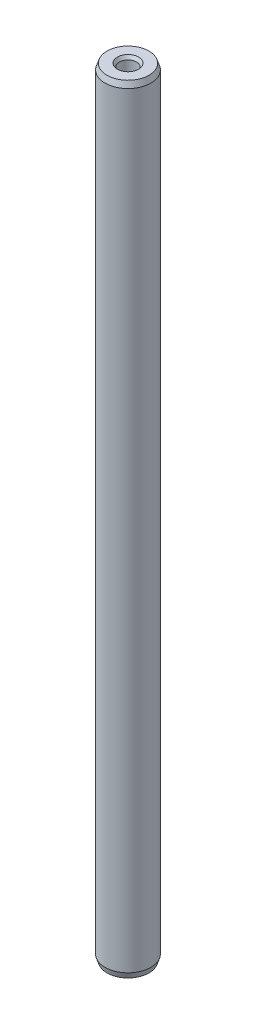
ISO-10303-21;
HEADER;
FILE_DESCRIPTION(('STEP AP214'),'2;1');
FILE_NAME('part.step','',(''),(''),'','','');
FILE_SCHEMA(('AUTOMOTIVE_DESIGN { 1 0 10303 214 1 1 1 1 }'));
ENDSEC;
DATA;
#1=APPLICATION_CONTEXT('core data for automotive mechanical design processes');
#2=APPLICATION_PROTOCOL_DEFINITION('international standard','automotive_design',2000,#1);
#3=PRODUCT_CONTEXT('',#1,'mechanical');
#4=PRODUCT('Part','Part','',(#3));
#5=PRODUCT_RELATED_PRODUCT_CATEGORY('part','',(#4));
#6=PRODUCT_DEFINITION_FORMATION('','',#4);
#7=PRODUCT_DEFINITION_CONTEXT('part definition',#1,'design');
#8=PRODUCT_DEFINITION('design','',#6,#7);
#9=PRODUCT_DEFINITION_SHAPE('','',#8);
#10=(LENGTH_UNIT() NAMED_UNIT(*) SI_UNIT(.MILLI.,.METRE.));
#11=(NAMED_UNIT(*) PLANE_ANGLE_UNIT() SI_UNIT($,.RADIAN.));
#12=(NAMED_UNIT(*) SI_UNIT($,.STERADIAN.) SOLID_ANGLE_UNIT());
#13=UNCERTAINTY_MEASURE_WITH_UNIT(LENGTH_MEASURE(1.E-05),#10,'distance_accuracy_value','');
#14=(GEOMETRIC_REPRESENTATION_CONTEXT(3) GLOBAL_UNCERTAINTY_ASSIGNED_CONTEXT((#13)) GLOBAL_UNIT_ASSIGNED_CONTEXT((#10,
#11,#12)) REPRESENTATION_CONTEXT('',''));
#15=CARTESIAN_POINT('',(0.,0.,0.));
#16=DIRECTION('',(0.,0.,1.));
#17=DIRECTION('',(1.,0.,0.));
#18=AXIS2_PLACEMENT_3D('',#15,#16,#17);
#19=CARTESIAN_POINT('',(-1.06592274227068,53.2859369307251,-1.12643595849704));
#20=DIRECTION('',(0.,-1.,0.));
#21=DIRECTION('',(0.,0.,-1.));
#22=AXIS2_PLACEMENT_3D('',#19,#20,#21);
#23=PLANE('',#22);
#24=CARTESIAN_POINT('',(-1.06592274227068,53.2859369307251,-1.12643595849704));
#25=DIRECTION('',(0.,-1.,0.));
#26=DIRECTION('',(0.,0.,-1.));
#27=AXIS2_PLACEMENT_3D('',#24,#25,#26);
#28=CIRCLE('',#27,1.38429999999998);
#29=CARTESIAN_POINT('',(-1.06592274227068,53.2859369307251,-2.51073595849702));
#30=VERTEX_POINT('',#29);
#31=EDGE_CURVE('E11',#30,#30,#28,.T.);
#32=ORIENTED_EDGE('',*,*,#31,.T.);
#33=EDGE_LOOP('',(#32));
#34=FACE_BOUND('',#33,.T.);
#35=CARTESIAN_POINT('',(-1.06592274227068,53.2859369307251,-1.12643595849704));
#36=DIRECTION('',(0.,1.,0.));
#37=DIRECTION('',(0.,0.,1.));
#38=AXIS2_PLACEMENT_3D('',#35,#36,#37);
#39=CIRCLE('',#38,2.74319999999999);
#40=CARTESIAN_POINT('',(-1.06592274227068,53.2859369307251,1.61676404150295));
#41=VERTEX_POINT('',#40);
#42=EDGE_CURVE('E57',#41,#41,#39,.T.);
#43=ORIENTED_EDGE('',*,*,#42,.T.);
#44=EDGE_LOOP('',(#43));
#45=FACE_BOUND('',#44,.T.);
#46=ADVANCED_FACE('F19',(#34,#45),#23,.F.);
#47=CARTESIAN_POINT('',(-1.06592274227068,52.5239369307251,-1.12643595849704));
#48=DIRECTION('',(0.,-1.,0.));
#49=DIRECTION('',(0.,0.,-1.));
#50=AXIS2_PLACEMENT_3D('',#47,#48,#49);
#51=CONICAL_SURFACE('',#50,2.9972,0.321750554396658);
#52=ORIENTED_EDGE('',*,*,#42,.F.);
#53=EDGE_LOOP('',(#52));
#54=FACE_BOUND('',#53,.T.);
#55=CARTESIAN_POINT('',(-1.06592274227068,52.5239369307251,-1.12643595849704));
#56=DIRECTION('',(0.,1.,0.));
#57=DIRECTION('',(0.,0.,1.));
#58=AXIS2_PLACEMENT_3D('',#55,#56,#57);
#59=CIRCLE('',#58,2.9972);
#60=CARTESIAN_POINT('',(-1.06592274227068,52.5239369307251,1.87076404150296));
#61=VERTEX_POINT('',#60);
#62=EDGE_CURVE('E54',#61,#61,#59,.T.);
#63=ORIENTED_EDGE('',*,*,#62,.T.);
#64=EDGE_LOOP('',(#63));
#65=FACE_BOUND('',#64,.T.);
#66=ADVANCED_FACE('F79',(#54,#65),#51,.T.);
#67=CARTESIAN_POINT('',(-1.06592274227068,53.2859369307251,-1.12643595849704));
#68=DIRECTION('',(0.,1.,0.));
#69=DIRECTION('',(0.,0.,1.));
#70=AXIS2_PLACEMENT_3D('',#67,#68,#69);
#71=CYLINDRICAL_SURFACE('',#70,2.9972);
#72=ORIENTED_EDGE('',*,*,#62,.F.);
#73=EDGE_LOOP('',(#72));
#74=FACE_BOUND('',#73,.T.);
#75=CARTESIAN_POINT('',(-1.06592274227068,-47.5520630692749,-1.12643595849704));
#76=DIRECTION('',(0.,1.,0.));
#77=DIRECTION('',(0.,0.,1.));
#78=AXIS2_PLACEMENT_3D('',#75,#76,#77);
#79=CIRCLE('',#78,2.9972);
#80=CARTESIAN_POINT('',(-1.06592274227068,-47.5520630692749,1.87076404150296));
#81=VERTEX_POINT('',#80);
#82=EDGE_CURVE('E51',#81,#81,#79,.T.);
#83=ORIENTED_EDGE('',*,*,#82,.T.);
#84=EDGE_LOOP('',(#83));
#85=FACE_BOUND('',#84,.T.);
#86=ADVANCED_FACE('F87',(#74,#85),#71,.T.);
#87=CARTESIAN_POINT('',(-1.06592274227068,-48.3140630692749,-1.12643595849704));
#88=DIRECTION('',(0.,1.,0.));
#89=DIRECTION('',(0.,0.,1.));
#90=AXIS2_PLACEMENT_3D('',#87,#88,#89);
#91=CONICAL_SURFACE('',#90,2.74319999999999,0.321750554396658);
#92=ORIENTED_EDGE('',*,*,#82,.F.);
#93=EDGE_LOOP('',(#92));
#94=FACE_BOUND('',#93,.T.);
#95=CARTESIAN_POINT('',(-1.06592274227068,-48.3140630692749,-1.12643595849704));
#96=DIRECTION('',(0.,1.,0.));
#97=DIRECTION('',(0.,0.,1.));
#98=AXIS2_PLACEMENT_3D('',#95,#96,#97);
#99=CIRCLE('',#98,2.74319999999999);
#100=CARTESIAN_POINT('',(-1.06592274227068,-48.3140630692749,1.61676404150295));
#101=VERTEX_POINT('',#100);
#102=EDGE_CURVE('E46',#101,#101,#99,.T.);
#103=ORIENTED_EDGE('',*,*,#102,.T.);
#104=EDGE_LOOP('',(#103));
#105=FACE_BOUND('',#104,.T.);
#106=ADVANCED_FACE('F94',(#94,#105),#91,.T.);
#107=CARTESIAN_POINT('',(1.67727725772931,-48.3140630692749,-1.12643595849704));
#108=DIRECTION('',(0.,1.,0.));
#109=DIRECTION('',(0.,0.,1.));
#110=AXIS2_PLACEMENT_3D('',#107,#108,#109);
#111=PLANE('',#110);
#112=CARTESIAN_POINT('',(-1.06592274227068,-48.3140630692749,-1.12643595849704));
#113=DIRECTION('',(0.,1.,0.));
#114=DIRECTION('',(0.,0.,1.));
#115=AXIS2_PLACEMENT_3D('',#112,#113,#114);
#116=CIRCLE('',#115,1.38429999999998);
#117=CARTESIAN_POINT('',(-1.06592274227068,-48.3140630692749,0.257864041502937));
#118=VERTEX_POINT('',#117);
#119=EDGE_CURVE('E63',#118,#118,#116,.T.);
#120=ORIENTED_EDGE('',*,*,#119,.T.);
#121=EDGE_LOOP('',(#120));
#122=FACE_BOUND('',#121,.T.);
#123=ORIENTED_EDGE('',*,*,#102,.F.);
#124=EDGE_LOOP('',(#123));
#125=FACE_BOUND('',#124,.T.);
#126=ADVANCED_FACE('F98',(#122,#125),#111,.F.);
#127=CARTESIAN_POINT('',(-1.06592274227068,-48.3140630692749,-1.12643595849704));
#128=DIRECTION('',(0.,-1.,0.));
#129=DIRECTION('',(0.,0.,-1.));
#130=AXIS2_PLACEMENT_3D('',#127,#128,#129);
#131=CYLINDRICAL_SURFACE('',#130,1.1303);
#132=CARTESIAN_POINT('',(-1.06592274227068,-47.8741221641525,-1.12643595849704));
#133=DIRECTION('',(0.,1.,0.));
#134=DIRECTION('',(0.,0.,1.));
#135=AXIS2_PLACEMENT_3D('',#132,#133,#134);
#136=CIRCLE('',#135,1.1303);
#137=CARTESIAN_POINT('',(-1.06592274227068,-47.8741221641525,0.00386404150295831));
#138=VERTEX_POINT('',#137);
#139=EDGE_CURVE('E60',#138,#138,#136,.F.);
#140=ORIENTED_EDGE('',*,*,#139,.T.);
#141=EDGE_LOOP('',(#140));
#142=FACE_BOUND('',#141,.T.);
#143=CARTESIAN_POINT('',(-1.06592274227068,-42.5990630692749,-1.12643595849704));
#144=DIRECTION('',(0.,-1.,0.));
#145=DIRECTION('',(0.,0.,-1.));
#146=AXIS2_PLACEMENT_3D('',#143,#144,#145);
#147=CIRCLE('',#146,1.1303);
#148=CARTESIAN_POINT('',(-1.06592274227068,-42.5990630692749,-2.25673595849704));
#149=VERTEX_POINT('',#148);
#150=EDGE_CURVE('E43',#149,#149,#147,.T.);
#151=ORIENTED_EDGE('',*,*,#150,.F.);
#152=EDGE_LOOP('',(#151));
#153=FACE_BOUND('',#152,.T.);
#154=ADVANCED_FACE('F102',(#142,#153),#131,.F.);
#155=CARTESIAN_POINT('',(-1.06592274227068,-42.5990630692749,-1.12643595849704));
#156=DIRECTION('',(0.,-1.,0.));
#157=DIRECTION('',(0.,0.,-1.));
#158=AXIS2_PLACEMENT_3D('',#155,#156,#157);
#159=CONICAL_SURFACE('',#158,1.1303,1.02974425867665);
#160=CARTESIAN_POINT('',(-1.06592274227068,-41.9199103115881,-1.12643595849704));
#161=VERTEX_POINT('',#160);
#162=VERTEX_LOOP('',#161);
#163=FACE_BOUND('',#162,.T.);
#164=ORIENTED_EDGE('',*,*,#150,.T.);
#165=EDGE_LOOP('',(#164));
#166=FACE_BOUND('',#165,.T.);
#167=ADVANCED_FACE('F106',(#163,#166),#159,.F.);
#168=CARTESIAN_POINT('',(-1.06592274227068,53.2859369307251,-1.12643595849704));
#169=DIRECTION('',(0.,1.,0.));
#170=DIRECTION('',(0.,0.,1.));
#171=AXIS2_PLACEMENT_3D('',#168,#169,#170);
#172=CYLINDRICAL_SURFACE('',#171,1.1303);
#173=CARTESIAN_POINT('',(-1.06592274227068,52.8459960256026,-1.12643595849704));
#174=DIRECTION('',(0.,-1.,0.));
#175=DIRECTION('',(0.,0.,-1.));
#176=AXIS2_PLACEMENT_3D('',#173,#174,#175);
#177=CIRCLE('',#176,1.1303);
#178=CARTESIAN_POINT('',(-1.06592274227068,52.8459960256026,-2.25673595849704));
#179=VERTEX_POINT('',#178);
#180=EDGE_CURVE('E27',#179,#179,#177,.F.);
#181=ORIENTED_EDGE('',*,*,#180,.T.);
#182=EDGE_LOOP('',(#181));
#183=FACE_BOUND('',#182,.T.);
#184=CARTESIAN_POINT('',(-1.06592274227068,47.5709369307251,-1.12643595849704));
#185=DIRECTION('',(0.,1.,0.));
#186=DIRECTION('',(0.,0.,1.));
#187=AXIS2_PLACEMENT_3D('',#184,#185,#186);
#188=CIRCLE('',#187,1.1303);
#189=CARTESIAN_POINT('',(-1.06592274227068,47.5709369307251,0.00386404150295766));
#190=VERTEX_POINT('',#189);
#191=EDGE_CURVE('E41',#190,#190,#188,.T.);
#192=ORIENTED_EDGE('',*,*,#191,.F.);
#193=EDGE_LOOP('',(#192));
#194=FACE_BOUND('',#193,.T.);
#195=ADVANCED_FACE('F37',(#183,#194),#172,.F.);
#196=CARTESIAN_POINT('',(-1.06592274227068,47.5709369307251,-1.12643595849704));
#197=DIRECTION('',(0.,1.,0.));
#198=DIRECTION('',(0.,0.,1.));
#199=AXIS2_PLACEMENT_3D('',#196,#197,#198);
#200=CONICAL_SURFACE('',#199,1.1303,1.02974425867665);
#201=CARTESIAN_POINT('',(-1.06592274227068,46.8917841730382,-1.12643595849704));
#202=VERTEX_POINT('',#201);
#203=VERTEX_LOOP('',#202);
#204=FACE_BOUND('',#203,.T.);
#205=ORIENTED_EDGE('',*,*,#191,.T.);
#206=EDGE_LOOP('',(#205));
#207=FACE_BOUND('',#206,.T.);
#208=ADVANCED_FACE('F33',(#204,#207),#200,.F.);
#209=CARTESIAN_POINT('',(-1.06592274227068,-47.8741221641525,-1.12643595849704));
#210=DIRECTION('',(0.,-1.,0.));
#211=DIRECTION('',(0.,0.,-1.));
#212=AXIS2_PLACEMENT_3D('',#209,#210,#211);
#213=CONICAL_SURFACE('',#212,1.1303,0.523598775598293);
#214=ORIENTED_EDGE('',*,*,#119,.F.);
#215=EDGE_LOOP('',(#214));
#216=FACE_BOUND('',#215,.T.);
#217=ORIENTED_EDGE('',*,*,#139,.F.);
#218=EDGE_LOOP('',(#217));
#219=FACE_BOUND('',#218,.T.);
#220=ADVANCED_FACE('F36',(#216,#219),#213,.F.);
#221=CARTESIAN_POINT('',(-1.06592274227068,52.8459960256026,-1.12643595849704));
#222=DIRECTION('',(0.,1.,0.));
#223=DIRECTION('',(0.,0.,1.));
#224=AXIS2_PLACEMENT_3D('',#221,#222,#223);
#225=CONICAL_SURFACE('',#224,1.1303,0.523598775598293);
#226=ORIENTED_EDGE('',*,*,#31,.F.);
#227=EDGE_LOOP('',(#226));
#228=FACE_BOUND('',#227,.T.);
#229=ORIENTED_EDGE('',*,*,#180,.F.);
#230=EDGE_LOOP('',(#229));
#231=FACE_BOUND('',#230,.T.);
#232=ADVANCED_FACE('F21',(#228,#231),#225,.F.);
#233=CLOSED_SHELL('',(#46,#66,#86,#106,#126,#154,#167,#195,#208,#220,#232));
#234=MANIFOLD_SOLID_BREP('B1',#233);
#235=ADVANCED_BREP_SHAPE_REPRESENTATION('',(#18,#234),#14);
#236=SHAPE_DEFINITION_REPRESENTATION(#9,#235);
ENDSEC;
END-ISO-10303-21;
